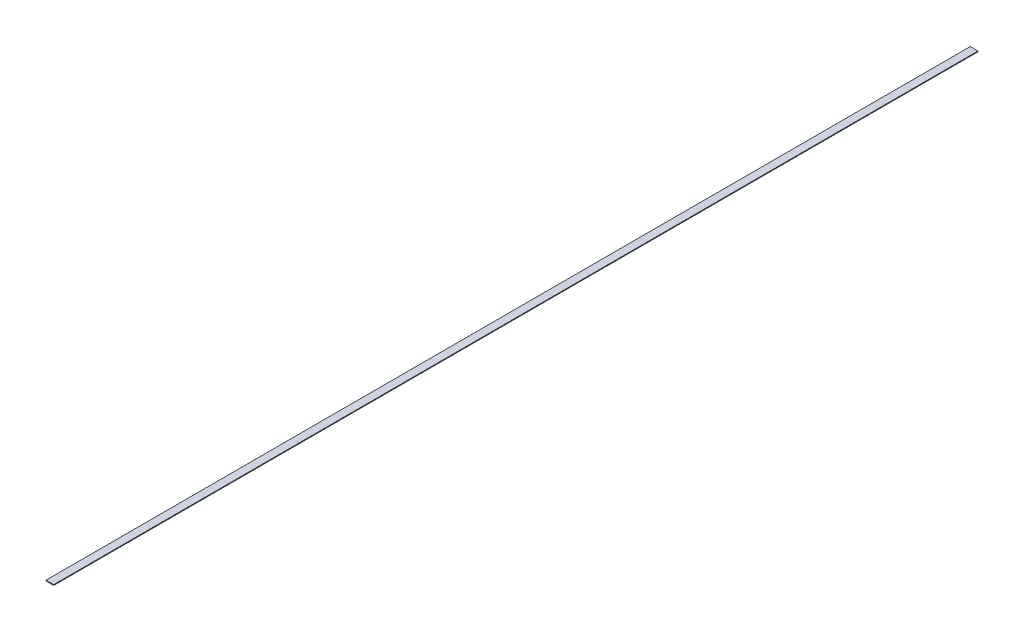
ISO-10303-21;
HEADER;
FILE_DESCRIPTION(('STEP AP214'),'2;1');
FILE_NAME('part.step','',(''),(''),'','','');
FILE_SCHEMA(('AUTOMOTIVE_DESIGN { 1 0 10303 214 1 1 1 1 }'));
ENDSEC;
DATA;
#1=APPLICATION_CONTEXT('core data for automotive mechanical design processes');
#2=APPLICATION_PROTOCOL_DEFINITION('international standard','automotive_design',2000,#1);
#3=PRODUCT_CONTEXT('',#1,'mechanical');
#4=PRODUCT('Part','Part','',(#3));
#5=PRODUCT_RELATED_PRODUCT_CATEGORY('part','',(#4));
#6=PRODUCT_DEFINITION_FORMATION('','',#4);
#7=PRODUCT_DEFINITION_CONTEXT('part definition',#1,'design');
#8=PRODUCT_DEFINITION('design','',#6,#7);
#9=PRODUCT_DEFINITION_SHAPE('','',#8);
#10=(LENGTH_UNIT() NAMED_UNIT(*) SI_UNIT(.MILLI.,.METRE.));
#11=(NAMED_UNIT(*) PLANE_ANGLE_UNIT() SI_UNIT($,.RADIAN.));
#12=(NAMED_UNIT(*) SI_UNIT($,.STERADIAN.) SOLID_ANGLE_UNIT());
#13=UNCERTAINTY_MEASURE_WITH_UNIT(LENGTH_MEASURE(1.E-05),#10,'distance_accuracy_value','');
#14=(GEOMETRIC_REPRESENTATION_CONTEXT(3) GLOBAL_UNCERTAINTY_ASSIGNED_CONTEXT((#13)) GLOBAL_UNIT_ASSIGNED_CONTEXT((#10,
#11,#12)) REPRESENTATION_CONTEXT('',''));
#15=CARTESIAN_POINT('',(0.,0.,0.));
#16=DIRECTION('',(0.,0.,1.));
#17=DIRECTION('',(1.,0.,0.));
#18=AXIS2_PLACEMENT_3D('',#15,#16,#17);
#19=CARTESIAN_POINT('',(-12.7,1.190625,1524.));
#20=DIRECTION('',(1.,0.,0.));
#21=DIRECTION('',(0.,0.,-1.));
#22=AXIS2_PLACEMENT_3D('',#19,#20,#21);
#23=PLANE('',#22);
#24=DIRECTION('',(0.,0.,-1.));
#25=VECTOR('',#24,1.);
#26=CARTESIAN_POINT('',(-12.7,1.190625,1524.));
#27=LINE('',#26,#25);
#28=CARTESIAN_POINT('',(-12.7,1.190625,1524.));
#29=VERTEX_POINT('',#28);
#30=CARTESIAN_POINT('',(-12.7,1.190625,-1524.));
#31=VERTEX_POINT('',#30);
#32=EDGE_CURVE('E89',#29,#31,#27,.T.);
#33=ORIENTED_EDGE('',*,*,#32,.T.);
#34=DIRECTION('',(0.,-1.,0.));
#35=VECTOR('',#34,1.);
#36=CARTESIAN_POINT('',(-12.7,1.190625,-1524.));
#37=LINE('',#36,#35);
#38=CARTESIAN_POINT('',(-12.7,-1.190625,-1524.));
#39=VERTEX_POINT('',#38);
#40=EDGE_CURVE('E84',#31,#39,#37,.T.);
#41=ORIENTED_EDGE('',*,*,#40,.T.);
#42=DIRECTION('',(0.,0.,-1.));
#43=VECTOR('',#42,1.);
#44=CARTESIAN_POINT('',(-12.7,-1.190625,1524.));
#45=LINE('',#44,#43);
#46=CARTESIAN_POINT('',(-12.7,-1.190625,1524.));
#47=VERTEX_POINT('',#46);
#48=EDGE_CURVE('E11',#47,#39,#45,.T.);
#49=ORIENTED_EDGE('',*,*,#48,.F.);
#50=DIRECTION('',(0.,-1.,0.));
#51=VECTOR('',#50,1.);
#52=CARTESIAN_POINT('',(-12.7,1.190625,1524.));
#53=LINE('',#52,#51);
#54=EDGE_CURVE('E95',#29,#47,#53,.T.);
#55=ORIENTED_EDGE('',*,*,#54,.F.);
#56=EDGE_LOOP('',(#33,#41,#49,#55));
#57=FACE_BOUND('',#56,.T.);
#58=ADVANCED_FACE('F32',(#57),#23,.F.);
#59=CARTESIAN_POINT('',(12.7,-1.190625,1524.));
#60=DIRECTION('',(0.,1.,0.));
#61=DIRECTION('',(0.,0.,1.));
#62=AXIS2_PLACEMENT_3D('',#59,#60,#61);
#63=PLANE('',#62);
#64=ORIENTED_EDGE('',*,*,#48,.T.);
#65=DIRECTION('',(1.,0.,0.));
#66=VECTOR('',#65,1.);
#67=CARTESIAN_POINT('',(12.7,-1.190625,-1524.));
#68=LINE('',#67,#66);
#69=CARTESIAN_POINT('',(12.7,-1.190625,-1524.));
#70=VERTEX_POINT('',#69);
#71=EDGE_CURVE('E74',#39,#70,#68,.T.);
#72=ORIENTED_EDGE('',*,*,#71,.T.);
#73=DIRECTION('',(0.,0.,-1.));
#74=VECTOR('',#73,1.);
#75=CARTESIAN_POINT('',(12.7,-1.190625,1524.));
#76=LINE('',#75,#74);
#77=CARTESIAN_POINT('',(12.7,-1.190625,1524.));
#78=VERTEX_POINT('',#77);
#79=EDGE_CURVE('E39',#78,#70,#76,.T.);
#80=ORIENTED_EDGE('',*,*,#79,.F.);
#81=DIRECTION('',(1.,0.,0.));
#82=VECTOR('',#81,1.);
#83=CARTESIAN_POINT('',(12.7,-1.190625,1524.));
#84=LINE('',#83,#82);
#85=EDGE_CURVE('E75',#47,#78,#84,.T.);
#86=ORIENTED_EDGE('',*,*,#85,.F.);
#87=EDGE_LOOP('',(#64,#72,#80,#86));
#88=FACE_BOUND('',#87,.T.);
#89=ADVANCED_FACE('F72',(#88),#63,.F.);
#90=CARTESIAN_POINT('',(12.7,1.190625,1524.));
#91=DIRECTION('',(-1.,0.,0.));
#92=DIRECTION('',(0.,0.,1.));
#93=AXIS2_PLACEMENT_3D('',#90,#91,#92);
#94=PLANE('',#93);
#95=ORIENTED_EDGE('',*,*,#79,.T.);
#96=DIRECTION('',(0.,1.,0.));
#97=VECTOR('',#96,1.);
#98=CARTESIAN_POINT('',(12.7,1.190625,-1524.));
#99=LINE('',#98,#97);
#100=CARTESIAN_POINT('',(12.7,1.190625,-1524.));
#101=VERTEX_POINT('',#100);
#102=EDGE_CURVE('E87',#70,#101,#99,.T.);
#103=ORIENTED_EDGE('',*,*,#102,.T.);
#104=DIRECTION('',(0.,0.,-1.));
#105=VECTOR('',#104,1.);
#106=CARTESIAN_POINT('',(12.7,1.190625,1524.));
#107=LINE('',#106,#105);
#108=CARTESIAN_POINT('',(12.7,1.190625,1524.));
#109=VERTEX_POINT('',#108);
#110=EDGE_CURVE('E101',#109,#101,#107,.T.);
#111=ORIENTED_EDGE('',*,*,#110,.F.);
#112=DIRECTION('',(0.,1.,0.));
#113=VECTOR('',#112,1.);
#114=CARTESIAN_POINT('',(12.7,1.190625,1524.));
#115=LINE('',#114,#113);
#116=EDGE_CURVE('E51',#78,#109,#115,.T.);
#117=ORIENTED_EDGE('',*,*,#116,.F.);
#118=EDGE_LOOP('',(#95,#103,#111,#117));
#119=FACE_BOUND('',#118,.T.);
#120=ADVANCED_FACE('F103',(#119),#94,.F.);
#121=CARTESIAN_POINT('',(12.7,1.190625,1524.));
#122=DIRECTION('',(0.,-1.,0.));
#123=DIRECTION('',(0.,0.,-1.));
#124=AXIS2_PLACEMENT_3D('',#121,#122,#123);
#125=PLANE('',#124);
#126=ORIENTED_EDGE('',*,*,#110,.T.);
#127=DIRECTION('',(-1.,0.,0.));
#128=VECTOR('',#127,1.);
#129=CARTESIAN_POINT('',(12.7,1.190625,-1524.));
#130=LINE('',#129,#128);
#131=EDGE_CURVE('E93',#101,#31,#130,.T.);
#132=ORIENTED_EDGE('',*,*,#131,.T.);
#133=ORIENTED_EDGE('',*,*,#32,.F.);
#134=DIRECTION('',(-1.,0.,0.));
#135=VECTOR('',#134,1.);
#136=CARTESIAN_POINT('',(12.7,1.190625,1524.));
#137=LINE('',#136,#135);
#138=EDGE_CURVE('E46',#109,#29,#137,.T.);
#139=ORIENTED_EDGE('',*,*,#138,.F.);
#140=EDGE_LOOP('',(#126,#132,#133,#139));
#141=FACE_BOUND('',#140,.T.);
#142=ADVANCED_FACE('F105',(#141),#125,.F.);
#143=CARTESIAN_POINT('',(0.,0.,1524.));
#144=DIRECTION('',(0.,0.,-1.));
#145=DIRECTION('',(-1.,0.,0.));
#146=AXIS2_PLACEMENT_3D('',#143,#144,#145);
#147=PLANE('',#146);
#148=ORIENTED_EDGE('',*,*,#54,.T.);
#149=ORIENTED_EDGE('',*,*,#85,.T.);
#150=ORIENTED_EDGE('',*,*,#116,.T.);
#151=ORIENTED_EDGE('',*,*,#138,.T.);
#152=EDGE_LOOP('',(#148,#149,#150,#151));
#153=FACE_BOUND('',#152,.T.);
#154=ADVANCED_FACE('F106',(#153),#147,.F.);
#155=CARTESIAN_POINT('',(0.,0.,-1524.));
#156=DIRECTION('',(0.,0.,-1.));
#157=DIRECTION('',(-1.,0.,0.));
#158=AXIS2_PLACEMENT_3D('',#155,#156,#157);
#159=PLANE('',#158);
#160=ORIENTED_EDGE('',*,*,#40,.F.);
#161=ORIENTED_EDGE('',*,*,#131,.F.);
#162=ORIENTED_EDGE('',*,*,#102,.F.);
#163=ORIENTED_EDGE('',*,*,#71,.F.);
#164=EDGE_LOOP('',(#160,#161,#162,#163));
#165=FACE_BOUND('',#164,.T.);
#166=ADVANCED_FACE('F82',(#165),#159,.T.);
#167=CLOSED_SHELL('',(#58,#89,#120,#142,#154,#166));
#168=MANIFOLD_SOLID_BREP('B2',#167);
#169=ADVANCED_BREP_SHAPE_REPRESENTATION('',(#18,#168),#14);
#170=SHAPE_DEFINITION_REPRESENTATION(#9,#169);
ENDSEC;
END-ISO-10303-21;
